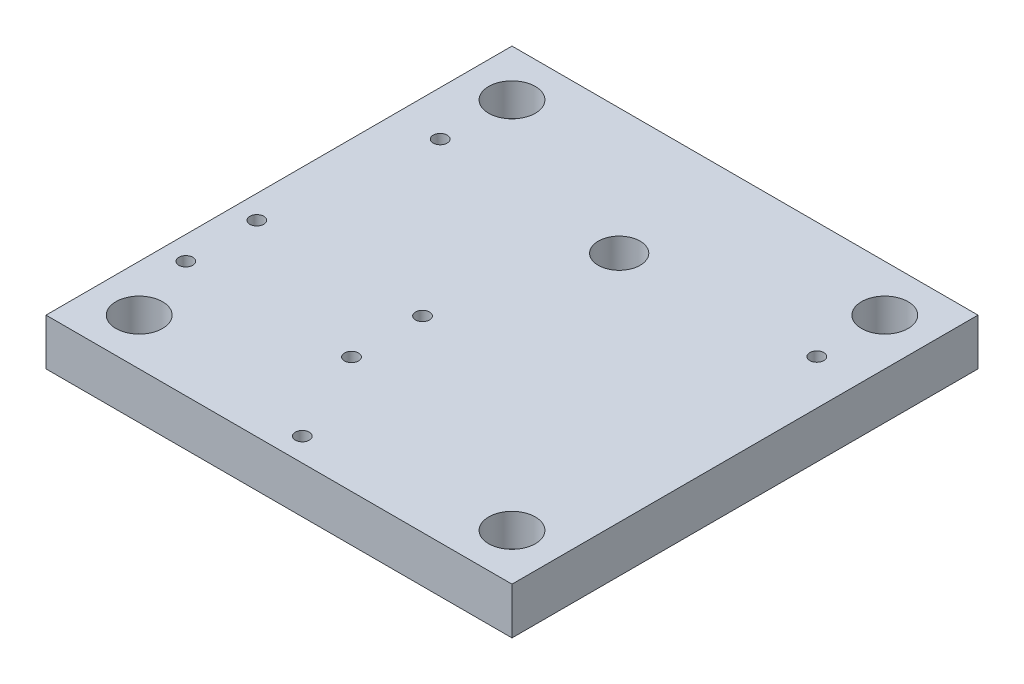
ISO-10303-21;
HEADER;
FILE_DESCRIPTION(('STEP AP214'),'2;1');
FILE_NAME('part.step','',(''),(''),'','','');
FILE_SCHEMA(('AUTOMOTIVE_DESIGN { 1 0 10303 214 1 1 1 1 }'));
ENDSEC;
DATA;
#1=APPLICATION_CONTEXT('core data for automotive mechanical design processes');
#2=APPLICATION_PROTOCOL_DEFINITION('international standard','automotive_design',2000,#1);
#3=PRODUCT_CONTEXT('',#1,'mechanical');
#4=PRODUCT('Part','Part','',(#3));
#5=PRODUCT_RELATED_PRODUCT_CATEGORY('part','',(#4));
#6=PRODUCT_DEFINITION_FORMATION('','',#4);
#7=PRODUCT_DEFINITION_CONTEXT('part definition',#1,'design');
#8=PRODUCT_DEFINITION('design','',#6,#7);
#9=PRODUCT_DEFINITION_SHAPE('','',#8);
#10=(LENGTH_UNIT() NAMED_UNIT(*) SI_UNIT(.MILLI.,.METRE.));
#11=(NAMED_UNIT(*) PLANE_ANGLE_UNIT() SI_UNIT($,.RADIAN.));
#12=(NAMED_UNIT(*) SI_UNIT($,.STERADIAN.) SOLID_ANGLE_UNIT());
#13=UNCERTAINTY_MEASURE_WITH_UNIT(LENGTH_MEASURE(1.E-05),#10,'distance_accuracy_value','');
#14=(GEOMETRIC_REPRESENTATION_CONTEXT(3) GLOBAL_UNCERTAINTY_ASSIGNED_CONTEXT((#13)) GLOBAL_UNIT_ASSIGNED_CONTEXT((#10,
#11,#12)) REPRESENTATION_CONTEXT('',''));
#15=CARTESIAN_POINT('',(0.,0.,0.));
#16=DIRECTION('',(0.,0.,1.));
#17=DIRECTION('',(1.,0.,0.));
#18=AXIS2_PLACEMENT_3D('',#15,#16,#17);
#19=CARTESIAN_POINT('',(50.,0.,27.));
#20=DIRECTION('',(0.,1.,0.));
#21=DIRECTION('',(0.,0.,1.));
#22=AXIS2_PLACEMENT_3D('',#19,#20,#21);
#23=CYLINDRICAL_SURFACE('',#22,4.5);
#24=CARTESIAN_POINT('',(50.,10.,27.));
#25=DIRECTION('',(0.,1.,0.));
#26=DIRECTION('',(0.,0.,1.));
#27=AXIS2_PLACEMENT_3D('',#24,#25,#26);
#28=CIRCLE('',#27,4.5);
#29=CARTESIAN_POINT('',(50.,10.,31.5));
#30=VERTEX_POINT('',#29);
#31=EDGE_CURVE('E142',#30,#30,#28,.T.);
#32=ORIENTED_EDGE('',*,*,#31,.T.);
#33=EDGE_LOOP('',(#32));
#34=FACE_BOUND('',#33,.T.);
#35=CARTESIAN_POINT('',(50.,3.,27.));
#36=DIRECTION('',(0.,-1.,0.));
#37=DIRECTION('',(0.,0.,-1.));
#38=AXIS2_PLACEMENT_3D('',#35,#36,#37);
#39=CIRCLE('',#38,4.5);
#40=CARTESIAN_POINT('',(50.,3.,22.5));
#41=VERTEX_POINT('',#40);
#42=EDGE_CURVE('E38',#41,#41,#39,.F.);
#43=ORIENTED_EDGE('',*,*,#42,.F.);
#44=EDGE_LOOP('',(#43));
#45=FACE_BOUND('',#44,.T.);
#46=ADVANCED_FACE('F34',(#34,#45),#23,.F.);
#47=CARTESIAN_POINT('',(0.,10.,0.));
#48=DIRECTION('',(1.,0.,0.));
#49=DIRECTION('',(0.,0.,-1.));
#50=AXIS2_PLACEMENT_3D('',#47,#48,#49);
#51=PLANE('',#50);
#52=DIRECTION('',(0.,0.,1.));
#53=VECTOR('',#52,1.);
#54=CARTESIAN_POINT('',(0.,0.,0.));
#55=LINE('',#54,#53);
#56=CARTESIAN_POINT('',(0.,0.,0.));
#57=VERTEX_POINT('',#56);
#58=CARTESIAN_POINT('',(0.,0.,100.));
#59=VERTEX_POINT('',#58);
#60=EDGE_CURVE('E100',#57,#59,#55,.T.);
#61=ORIENTED_EDGE('',*,*,#60,.T.);
#62=DIRECTION('',(0.,-1.,0.));
#63=VECTOR('',#62,1.);
#64=CARTESIAN_POINT('',(0.,10.,100.));
#65=LINE('',#64,#63);
#66=CARTESIAN_POINT('',(0.,10.,100.));
#67=VERTEX_POINT('',#66);
#68=EDGE_CURVE('E11',#67,#59,#65,.T.);
#69=ORIENTED_EDGE('',*,*,#68,.F.);
#70=DIRECTION('',(0.,0.,1.));
#71=VECTOR('',#70,1.);
#72=CARTESIAN_POINT('',(0.,10.,0.));
#73=LINE('',#72,#71);
#74=CARTESIAN_POINT('',(0.,10.,0.));
#75=VERTEX_POINT('',#74);
#76=EDGE_CURVE('E87',#75,#67,#73,.T.);
#77=ORIENTED_EDGE('',*,*,#76,.F.);
#78=DIRECTION('',(0.,-1.,0.));
#79=VECTOR('',#78,1.);
#80=CARTESIAN_POINT('',(0.,10.,0.));
#81=LINE('',#80,#79);
#82=EDGE_CURVE('E96',#75,#57,#81,.T.);
#83=ORIENTED_EDGE('',*,*,#82,.T.);
#84=EDGE_LOOP('',(#61,#69,#77,#83));
#85=FACE_BOUND('',#84,.T.);
#86=ADVANCED_FACE('F36',(#85),#51,.F.);
#87=CARTESIAN_POINT('',(0.,10.,100.));
#88=DIRECTION('',(0.,0.,-1.));
#89=DIRECTION('',(-1.,0.,0.));
#90=AXIS2_PLACEMENT_3D('',#87,#88,#89);
#91=PLANE('',#90);
#92=DIRECTION('',(1.,0.,0.));
#93=VECTOR('',#92,1.);
#94=CARTESIAN_POINT('',(0.,0.,100.));
#95=LINE('',#94,#93);
#96=CARTESIAN_POINT('',(100.,0.,100.));
#97=VERTEX_POINT('',#96);
#98=EDGE_CURVE('E91',#59,#97,#95,.T.);
#99=ORIENTED_EDGE('',*,*,#98,.T.);
#100=DIRECTION('',(0.,-1.,0.));
#101=VECTOR('',#100,1.);
#102=CARTESIAN_POINT('',(100.,10.,100.));
#103=LINE('',#102,#101);
#104=CARTESIAN_POINT('',(100.,10.,100.));
#105=VERTEX_POINT('',#104);
#106=EDGE_CURVE('E44',#105,#97,#103,.T.);
#107=ORIENTED_EDGE('',*,*,#106,.F.);
#108=DIRECTION('',(1.,0.,0.));
#109=VECTOR('',#108,1.);
#110=CARTESIAN_POINT('',(0.,10.,100.));
#111=LINE('',#110,#109);
#112=EDGE_CURVE('E82',#67,#105,#111,.T.);
#113=ORIENTED_EDGE('',*,*,#112,.F.);
#114=ORIENTED_EDGE('',*,*,#68,.T.);
#115=EDGE_LOOP('',(#99,#107,#113,#114));
#116=FACE_BOUND('',#115,.T.);
#117=ADVANCED_FACE('F90',(#116),#91,.F.);
#118=CARTESIAN_POINT('',(100.,10.,0.));
#119=DIRECTION('',(-1.,0.,0.));
#120=DIRECTION('',(0.,0.,1.));
#121=AXIS2_PLACEMENT_3D('',#118,#119,#120);
#122=PLANE('',#121);
#123=DIRECTION('',(0.,0.,-1.));
#124=VECTOR('',#123,1.);
#125=CARTESIAN_POINT('',(100.,0.,0.));
#126=LINE('',#125,#124);
#127=CARTESIAN_POINT('',(100.,0.,0.));
#128=VERTEX_POINT('',#127);
#129=EDGE_CURVE('E69',#97,#128,#126,.T.);
#130=ORIENTED_EDGE('',*,*,#129,.T.);
#131=DIRECTION('',(0.,-1.,0.));
#132=VECTOR('',#131,1.);
#133=CARTESIAN_POINT('',(100.,10.,0.));
#134=LINE('',#133,#132);
#135=CARTESIAN_POINT('',(100.,10.,0.));
#136=VERTEX_POINT('',#135);
#137=EDGE_CURVE('E92',#136,#128,#134,.T.);
#138=ORIENTED_EDGE('',*,*,#137,.F.);
#139=DIRECTION('',(0.,0.,-1.));
#140=VECTOR('',#139,1.);
#141=CARTESIAN_POINT('',(100.,10.,0.));
#142=LINE('',#141,#140);
#143=EDGE_CURVE('E85',#105,#136,#142,.T.);
#144=ORIENTED_EDGE('',*,*,#143,.F.);
#145=ORIENTED_EDGE('',*,*,#106,.T.);
#146=EDGE_LOOP('',(#130,#138,#144,#145));
#147=FACE_BOUND('',#146,.T.);
#148=ADVANCED_FACE('F94',(#147),#122,.F.);
#149=CARTESIAN_POINT('',(0.,10.,0.));
#150=DIRECTION('',(0.,0.,1.));
#151=DIRECTION('',(1.,0.,0.));
#152=AXIS2_PLACEMENT_3D('',#149,#150,#151);
#153=PLANE('',#152);
#154=DIRECTION('',(-1.,0.,0.));
#155=VECTOR('',#154,1.);
#156=CARTESIAN_POINT('',(0.,0.,0.));
#157=LINE('',#156,#155);
#158=EDGE_CURVE('E75',#128,#57,#157,.T.);
#159=ORIENTED_EDGE('',*,*,#158,.T.);
#160=ORIENTED_EDGE('',*,*,#82,.F.);
#161=DIRECTION('',(-1.,0.,0.));
#162=VECTOR('',#161,1.);
#163=CARTESIAN_POINT('',(0.,10.,0.));
#164=LINE('',#163,#162);
#165=EDGE_CURVE('E52',#136,#75,#164,.T.);
#166=ORIENTED_EDGE('',*,*,#165,.F.);
#167=ORIENTED_EDGE('',*,*,#137,.T.);
#168=EDGE_LOOP('',(#159,#160,#166,#167));
#169=FACE_BOUND('',#168,.T.);
#170=ADVANCED_FACE('F108',(#169),#153,.F.);
#171=CARTESIAN_POINT('',(0.,10.,0.));
#172=DIRECTION('',(0.,1.,0.));
#173=DIRECTION('',(0.,0.,1.));
#174=AXIS2_PLACEMENT_3D('',#171,#172,#173);
#175=PLANE('',#174);
#176=CARTESIAN_POINT('',(40.56,10.,75.));
#177=DIRECTION('',(0.,1.,0.));
#178=DIRECTION('',(0.,0.,1.));
#179=AXIS2_PLACEMENT_3D('',#176,#177,#178);
#180=CIRCLE('',#179,1.5);
#181=CARTESIAN_POINT('',(40.56,10.,76.5));
#182=VERTEX_POINT('',#181);
#183=EDGE_CURVE('E178',#182,#182,#180,.T.);
#184=ORIENTED_EDGE('',*,*,#183,.F.);
#185=EDGE_LOOP('',(#184));
#186=FACE_BOUND('',#185,.T.);
#187=CARTESIAN_POINT('',(5.,10.,59.76));
#188=DIRECTION('',(0.,1.,0.));
#189=DIRECTION('',(0.,0.,1.));
#190=AXIS2_PLACEMENT_3D('',#187,#188,#189);
#191=CIRCLE('',#190,1.5);
#192=CARTESIAN_POINT('',(5.,10.,61.26));
#193=VERTEX_POINT('',#192);
#194=EDGE_CURVE('E171',#193,#193,#191,.T.);
#195=ORIENTED_EDGE('',*,*,#194,.F.);
#196=EDGE_LOOP('',(#195));
#197=FACE_BOUND('',#196,.T.);
#198=CARTESIAN_POINT('',(5.,10.,75.));
#199=DIRECTION('',(0.,1.,0.));
#200=DIRECTION('',(0.,0.,1.));
#201=AXIS2_PLACEMENT_3D('',#198,#199,#200);
#202=CIRCLE('',#201,1.5);
#203=CARTESIAN_POINT('',(5.,10.,76.5));
#204=VERTEX_POINT('',#203);
#205=EDGE_CURVE('E183',#204,#204,#202,.T.);
#206=ORIENTED_EDGE('',*,*,#205,.F.);
#207=EDGE_LOOP('',(#206));
#208=FACE_BOUND('',#207,.T.);
#209=CARTESIAN_POINT('',(40.56,10.,59.76));
#210=DIRECTION('',(0.,1.,0.));
#211=DIRECTION('',(0.,0.,1.));
#212=AXIS2_PLACEMENT_3D('',#209,#210,#211);
#213=CIRCLE('',#212,1.5);
#214=CARTESIAN_POINT('',(40.56,10.,61.26));
#215=VERTEX_POINT('',#214);
#216=EDGE_CURVE('E165',#215,#215,#213,.T.);
#217=ORIENTED_EDGE('',*,*,#216,.F.);
#218=EDGE_LOOP('',(#217));
#219=FACE_BOUND('',#218,.T.);
#220=ORIENTED_EDGE('',*,*,#31,.F.);
#221=EDGE_LOOP('',(#220));
#222=FACE_BOUND('',#221,.T.);
#223=CARTESIAN_POINT('',(50.,10.,95.));
#224=DIRECTION('',(0.,1.,0.));
#225=DIRECTION('',(0.,0.,1.));
#226=AXIS2_PLACEMENT_3D('',#223,#224,#225);
#227=CIRCLE('',#226,1.5);
#228=CARTESIAN_POINT('',(50.,10.,96.5));
#229=VERTEX_POINT('',#228);
#230=EDGE_CURVE('E151',#229,#229,#227,.T.);
#231=ORIENTED_EDGE('',*,*,#230,.F.);
#232=EDGE_LOOP('',(#231));
#233=FACE_BOUND('',#232,.T.);
#234=CARTESIAN_POINT('',(90.4145188432738,10.,25.));
#235=DIRECTION('',(0.,1.,0.));
#236=DIRECTION('',(0.,0.,1.));
#237=AXIS2_PLACEMENT_3D('',#234,#235,#236);
#238=CIRCLE('',#237,1.5);
#239=CARTESIAN_POINT('',(90.4145188432738,10.,26.5));
#240=VERTEX_POINT('',#239);
#241=EDGE_CURVE('E145',#240,#240,#238,.T.);
#242=ORIENTED_EDGE('',*,*,#241,.F.);
#243=EDGE_LOOP('',(#242));
#244=FACE_BOUND('',#243,.T.);
#245=CARTESIAN_POINT('',(9.58548115672619,10.,25.));
#246=DIRECTION('',(0.,1.,0.));
#247=DIRECTION('',(0.,0.,1.));
#248=AXIS2_PLACEMENT_3D('',#245,#246,#247);
#249=CIRCLE('',#248,1.5);
#250=CARTESIAN_POINT('',(9.58548115672619,10.,26.5));
#251=VERTEX_POINT('',#250);
#252=EDGE_CURVE('E138',#251,#251,#249,.T.);
#253=ORIENTED_EDGE('',*,*,#252,.F.);
#254=EDGE_LOOP('',(#253));
#255=FACE_BOUND('',#254,.T.);
#256=CARTESIAN_POINT('',(90.,10.,9.99999999999998));
#257=DIRECTION('',(0.,1.,0.));
#258=DIRECTION('',(0.,0.,1.));
#259=AXIS2_PLACEMENT_3D('',#256,#257,#258);
#260=CIRCLE('',#259,5.);
#261=CARTESIAN_POINT('',(90.,10.,15.));
#262=VERTEX_POINT('',#261);
#263=EDGE_CURVE('E127',#262,#262,#260,.T.);
#264=ORIENTED_EDGE('',*,*,#263,.F.);
#265=EDGE_LOOP('',(#264));
#266=FACE_BOUND('',#265,.T.);
#267=CARTESIAN_POINT('',(10.,10.,90.));
#268=DIRECTION('',(0.,1.,0.));
#269=DIRECTION('',(0.,0.,1.));
#270=AXIS2_PLACEMENT_3D('',#267,#268,#269);
#271=CIRCLE('',#270,5.);
#272=CARTESIAN_POINT('',(10.,10.,95.));
#273=VERTEX_POINT('',#272);
#274=EDGE_CURVE('E120',#273,#273,#271,.T.);
#275=ORIENTED_EDGE('',*,*,#274,.F.);
#276=EDGE_LOOP('',(#275));
#277=FACE_BOUND('',#276,.T.);
#278=CARTESIAN_POINT('',(90.,10.,90.));
#279=DIRECTION('',(0.,1.,0.));
#280=DIRECTION('',(0.,0.,1.));
#281=AXIS2_PLACEMENT_3D('',#278,#279,#280);
#282=CIRCLE('',#281,5.00000000000001);
#283=CARTESIAN_POINT('',(90.,10.,95.));
#284=VERTEX_POINT('',#283);
#285=EDGE_CURVE('E132',#284,#284,#282,.T.);
#286=ORIENTED_EDGE('',*,*,#285,.F.);
#287=EDGE_LOOP('',(#286));
#288=FACE_BOUND('',#287,.T.);
#289=CARTESIAN_POINT('',(9.99999999999999,10.,10.));
#290=DIRECTION('',(0.,1.,0.));
#291=DIRECTION('',(0.,0.,1.));
#292=AXIS2_PLACEMENT_3D('',#289,#290,#291);
#293=CIRCLE('',#292,5.);
#294=CARTESIAN_POINT('',(9.99999999999999,10.,15.));
#295=VERTEX_POINT('',#294);
#296=EDGE_CURVE('E114',#295,#295,#293,.T.);
#297=ORIENTED_EDGE('',*,*,#296,.F.);
#298=EDGE_LOOP('',(#297));
#299=FACE_BOUND('',#298,.T.);
#300=ORIENTED_EDGE('',*,*,#76,.T.);
#301=ORIENTED_EDGE('',*,*,#112,.T.);
#302=ORIENTED_EDGE('',*,*,#143,.T.);
#303=ORIENTED_EDGE('',*,*,#165,.T.);
#304=EDGE_LOOP('',(#300,#301,#302,#303));
#305=FACE_BOUND('',#304,.T.);
#306=ADVANCED_FACE('F83',(#186,#197,#208,#219,#222,#233,#244,#255,#266,#277,#288,#299,#305),
#175,.T.);
#307=CARTESIAN_POINT('',(0.,0.,0.));
#308=DIRECTION('',(0.,1.,0.));
#309=DIRECTION('',(0.,0.,1.));
#310=AXIS2_PLACEMENT_3D('',#307,#308,#309);
#311=PLANE('',#310);
#312=CARTESIAN_POINT('',(65.,0.,27.));
#313=DIRECTION('',(0.,-1.,0.));
#314=DIRECTION('',(0.,0.,-1.));
#315=AXIS2_PLACEMENT_3D('',#312,#313,#314);
#316=CIRCLE('',#315,1.4);
#317=CARTESIAN_POINT('',(65.,0.,25.6));
#318=VERTEX_POINT('',#317);
#319=EDGE_CURVE('E195',#318,#318,#316,.T.);
#320=ORIENTED_EDGE('',*,*,#319,.F.);
#321=EDGE_LOOP('',(#320));
#322=FACE_BOUND('',#321,.T.);
#323=CARTESIAN_POINT('',(35.,0.,27.));
#324=DIRECTION('',(0.,-1.,0.));
#325=DIRECTION('',(0.,0.,-1.));
#326=AXIS2_PLACEMENT_3D('',#323,#324,#325);
#327=CIRCLE('',#326,1.4);
#328=CARTESIAN_POINT('',(35.,0.,25.6));
#329=VERTEX_POINT('',#328);
#330=EDGE_CURVE('E189',#329,#329,#327,.T.);
#331=ORIENTED_EDGE('',*,*,#330,.F.);
#332=EDGE_LOOP('',(#331));
#333=FACE_BOUND('',#332,.T.);
#334=CARTESIAN_POINT('',(40.56,0.,75.));
#335=DIRECTION('',(0.,1.,0.));
#336=DIRECTION('',(0.,0.,1.));
#337=AXIS2_PLACEMENT_3D('',#334,#335,#336);
#338=CIRCLE('',#337,1.5);
#339=CARTESIAN_POINT('',(40.56,0.,76.5));
#340=VERTEX_POINT('',#339);
#341=EDGE_CURVE('E168',#340,#340,#338,.T.);
#342=ORIENTED_EDGE('',*,*,#341,.T.);
#343=EDGE_LOOP('',(#342));
#344=FACE_BOUND('',#343,.T.);
#345=CARTESIAN_POINT('',(5.,0.,59.76));
#346=DIRECTION('',(0.,1.,0.));
#347=DIRECTION('',(0.,0.,1.));
#348=AXIS2_PLACEMENT_3D('',#345,#346,#347);
#349=CIRCLE('',#348,1.5);
#350=CARTESIAN_POINT('',(5.,0.,61.26));
#351=VERTEX_POINT('',#350);
#352=EDGE_CURVE('E174',#351,#351,#349,.T.);
#353=ORIENTED_EDGE('',*,*,#352,.T.);
#354=EDGE_LOOP('',(#353));
#355=FACE_BOUND('',#354,.T.);
#356=CARTESIAN_POINT('',(5.,0.,75.));
#357=DIRECTION('',(0.,1.,0.));
#358=DIRECTION('',(0.,0.,1.));
#359=AXIS2_PLACEMENT_3D('',#356,#357,#358);
#360=CIRCLE('',#359,1.5);
#361=CARTESIAN_POINT('',(5.,0.,76.5));
#362=VERTEX_POINT('',#361);
#363=EDGE_CURVE('E175',#362,#362,#360,.T.);
#364=ORIENTED_EDGE('',*,*,#363,.T.);
#365=EDGE_LOOP('',(#364));
#366=FACE_BOUND('',#365,.T.);
#367=CARTESIAN_POINT('',(40.56,0.,59.76));
#368=DIRECTION('',(0.,1.,0.));
#369=DIRECTION('',(0.,0.,1.));
#370=AXIS2_PLACEMENT_3D('',#367,#368,#369);
#371=CIRCLE('',#370,1.5);
#372=CARTESIAN_POINT('',(40.56,0.,61.26));
#373=VERTEX_POINT('',#372);
#374=EDGE_CURVE('E162',#373,#373,#371,.T.);
#375=ORIENTED_EDGE('',*,*,#374,.T.);
#376=EDGE_LOOP('',(#375));
#377=FACE_BOUND('',#376,.T.);
#378=CARTESIAN_POINT('',(50.,0.,27.));
#379=DIRECTION('',(0.,-1.,0.));
#380=DIRECTION('',(0.,0.,-1.));
#381=AXIS2_PLACEMENT_3D('',#378,#379,#380);
#382=CIRCLE('',#381,6.5);
#383=CARTESIAN_POINT('',(50.,0.,20.5));
#384=VERTEX_POINT('',#383);
#385=EDGE_CURVE('E158',#384,#384,#382,.T.);
#386=ORIENTED_EDGE('',*,*,#385,.F.);
#387=EDGE_LOOP('',(#386));
#388=FACE_BOUND('',#387,.T.);
#389=CARTESIAN_POINT('',(50.,0.,95.));
#390=DIRECTION('',(0.,1.,0.));
#391=DIRECTION('',(0.,0.,1.));
#392=AXIS2_PLACEMENT_3D('',#389,#390,#391);
#393=CIRCLE('',#392,1.5);
#394=CARTESIAN_POINT('',(50.,0.,96.5));
#395=VERTEX_POINT('',#394);
#396=EDGE_CURVE('E135',#395,#395,#393,.T.);
#397=ORIENTED_EDGE('',*,*,#396,.T.);
#398=EDGE_LOOP('',(#397));
#399=FACE_BOUND('',#398,.T.);
#400=CARTESIAN_POINT('',(90.4145188432738,0.,25.));
#401=DIRECTION('',(0.,1.,0.));
#402=DIRECTION('',(0.,0.,1.));
#403=AXIS2_PLACEMENT_3D('',#400,#401,#402);
#404=CIRCLE('',#403,1.5);
#405=CARTESIAN_POINT('',(90.4145188432738,0.,26.5));
#406=VERTEX_POINT('',#405);
#407=EDGE_CURVE('E148',#406,#406,#404,.T.);
#408=ORIENTED_EDGE('',*,*,#407,.T.);
#409=EDGE_LOOP('',(#408));
#410=FACE_BOUND('',#409,.T.);
#411=CARTESIAN_POINT('',(9.58548115672619,0.,25.));
#412=DIRECTION('',(0.,1.,0.));
#413=DIRECTION('',(0.,0.,1.));
#414=AXIS2_PLACEMENT_3D('',#411,#412,#413);
#415=CIRCLE('',#414,1.5);
#416=CARTESIAN_POINT('',(9.58548115672619,0.,26.5));
#417=VERTEX_POINT('',#416);
#418=EDGE_CURVE('E141',#417,#417,#415,.T.);
#419=ORIENTED_EDGE('',*,*,#418,.T.);
#420=EDGE_LOOP('',(#419));
#421=FACE_BOUND('',#420,.T.);
#422=ORIENTED_EDGE('',*,*,#60,.F.);
#423=ORIENTED_EDGE('',*,*,#158,.F.);
#424=ORIENTED_EDGE('',*,*,#129,.F.);
#425=ORIENTED_EDGE('',*,*,#98,.F.);
#426=EDGE_LOOP('',(#422,#423,#424,#425));
#427=FACE_BOUND('',#426,.T.);
#428=ADVANCED_FACE('F111',(#322,#333,#344,#355,#366,#377,#388,#399,#410,#421,#427),#311,.F.);
#429=CARTESIAN_POINT('',(9.99999999999999,3.,10.));
#430=DIRECTION('',(0.,1.,0.));
#431=DIRECTION('',(0.,0.,1.));
#432=AXIS2_PLACEMENT_3D('',#429,#430,#431);
#433=CYLINDRICAL_SURFACE('',#432,5.);
#434=CARTESIAN_POINT('',(9.99999999999999,3.,10.));
#435=DIRECTION('',(0.,1.,0.));
#436=DIRECTION('',(0.,0.,1.));
#437=AXIS2_PLACEMENT_3D('',#434,#435,#436);
#438=CIRCLE('',#437,5.);
#439=CARTESIAN_POINT('',(9.99999999999999,3.,15.));
#440=VERTEX_POINT('',#439);
#441=EDGE_CURVE('E103',#440,#440,#438,.T.);
#442=ORIENTED_EDGE('',*,*,#441,.F.);
#443=EDGE_LOOP('',(#442));
#444=FACE_BOUND('',#443,.T.);
#445=ORIENTED_EDGE('',*,*,#296,.T.);
#446=EDGE_LOOP('',(#445));
#447=FACE_BOUND('',#446,.T.);
#448=ADVANCED_FACE('F212',(#444,#447),#433,.F.);
#449=CARTESIAN_POINT('',(9.99999999999999,3.,10.));
#450=DIRECTION('',(0.,1.,0.));
#451=DIRECTION('',(0.,0.,1.));
#452=AXIS2_PLACEMENT_3D('',#449,#450,#451);
#453=PLANE('',#452);
#454=ORIENTED_EDGE('',*,*,#441,.T.);
#455=EDGE_LOOP('',(#454));
#456=FACE_BOUND('',#455,.T.);
#457=ADVANCED_FACE('F253',(#456),#453,.T.);
#458=CARTESIAN_POINT('',(90.,3.,90.));
#459=DIRECTION('',(0.,1.,0.));
#460=DIRECTION('',(0.,0.,1.));
#461=AXIS2_PLACEMENT_3D('',#458,#459,#460);
#462=CYLINDRICAL_SURFACE('',#461,5.00000000000001);
#463=CARTESIAN_POINT('',(90.,3.,90.));
#464=DIRECTION('',(0.,1.,0.));
#465=DIRECTION('',(0.,0.,1.));
#466=AXIS2_PLACEMENT_3D('',#463,#464,#465);
#467=CIRCLE('',#466,5.00000000000001);
#468=CARTESIAN_POINT('',(90.,3.,95.));
#469=VERTEX_POINT('',#468);
#470=EDGE_CURVE('E124',#469,#469,#467,.T.);
#471=ORIENTED_EDGE('',*,*,#470,.F.);
#472=EDGE_LOOP('',(#471));
#473=FACE_BOUND('',#472,.T.);
#474=ORIENTED_EDGE('',*,*,#285,.T.);
#475=EDGE_LOOP('',(#474));
#476=FACE_BOUND('',#475,.T.);
#477=ADVANCED_FACE('F259',(#473,#476),#462,.F.);
#478=CARTESIAN_POINT('',(90.,3.,90.));
#479=DIRECTION('',(0.,1.,0.));
#480=DIRECTION('',(0.,0.,1.));
#481=AXIS2_PLACEMENT_3D('',#478,#479,#480);
#482=PLANE('',#481);
#483=ORIENTED_EDGE('',*,*,#470,.T.);
#484=EDGE_LOOP('',(#483));
#485=FACE_BOUND('',#484,.T.);
#486=ADVANCED_FACE('F282',(#485),#482,.T.);
#487=CARTESIAN_POINT('',(10.,3.,90.));
#488=DIRECTION('',(0.,1.,0.));
#489=DIRECTION('',(0.,0.,1.));
#490=AXIS2_PLACEMENT_3D('',#487,#488,#489);
#491=CYLINDRICAL_SURFACE('',#490,5.);
#492=CARTESIAN_POINT('',(10.,3.,90.));
#493=DIRECTION('',(0.,1.,0.));
#494=DIRECTION('',(0.,0.,1.));
#495=AXIS2_PLACEMENT_3D('',#492,#493,#494);
#496=CIRCLE('',#495,5.);
#497=CARTESIAN_POINT('',(10.,3.,95.));
#498=VERTEX_POINT('',#497);
#499=EDGE_CURVE('E123',#498,#498,#496,.T.);
#500=ORIENTED_EDGE('',*,*,#499,.F.);
#501=EDGE_LOOP('',(#500));
#502=FACE_BOUND('',#501,.T.);
#503=ORIENTED_EDGE('',*,*,#274,.T.);
#504=EDGE_LOOP('',(#503));
#505=FACE_BOUND('',#504,.T.);
#506=ADVANCED_FACE('F285',(#502,#505),#491,.F.);
#507=CARTESIAN_POINT('',(10.,3.,90.));
#508=DIRECTION('',(0.,1.,0.));
#509=DIRECTION('',(0.,0.,1.));
#510=AXIS2_PLACEMENT_3D('',#507,#508,#509);
#511=PLANE('',#510);
#512=ORIENTED_EDGE('',*,*,#499,.T.);
#513=EDGE_LOOP('',(#512));
#514=FACE_BOUND('',#513,.T.);
#515=ADVANCED_FACE('F296',(#514),#511,.T.);
#516=CARTESIAN_POINT('',(90.,3.,9.99999999999998));
#517=DIRECTION('',(0.,1.,0.));
#518=DIRECTION('',(0.,0.,1.));
#519=AXIS2_PLACEMENT_3D('',#516,#517,#518);
#520=CYLINDRICAL_SURFACE('',#519,5.);
#521=CARTESIAN_POINT('',(90.,3.,9.99999999999998));
#522=DIRECTION('',(0.,1.,0.));
#523=DIRECTION('',(0.,0.,1.));
#524=AXIS2_PLACEMENT_3D('',#521,#522,#523);
#525=CIRCLE('',#524,5.);
#526=CARTESIAN_POINT('',(90.,3.,15.));
#527=VERTEX_POINT('',#526);
#528=EDGE_CURVE('E117',#527,#527,#525,.T.);
#529=ORIENTED_EDGE('',*,*,#528,.F.);
#530=EDGE_LOOP('',(#529));
#531=FACE_BOUND('',#530,.T.);
#532=ORIENTED_EDGE('',*,*,#263,.T.);
#533=EDGE_LOOP('',(#532));
#534=FACE_BOUND('',#533,.T.);
#535=ADVANCED_FACE('F292',(#531,#534),#520,.F.);
#536=CARTESIAN_POINT('',(90.,3.,9.99999999999998));
#537=DIRECTION('',(0.,1.,0.));
#538=DIRECTION('',(0.,0.,1.));
#539=AXIS2_PLACEMENT_3D('',#536,#537,#538);
#540=PLANE('',#539);
#541=ORIENTED_EDGE('',*,*,#528,.T.);
#542=EDGE_LOOP('',(#541));
#543=FACE_BOUND('',#542,.T.);
#544=ADVANCED_FACE('F236',(#543),#540,.T.);
#545=CARTESIAN_POINT('',(9.58548115672619,0.,25.));
#546=DIRECTION('',(0.,1.,0.));
#547=DIRECTION('',(0.,0.,1.));
#548=AXIS2_PLACEMENT_3D('',#545,#546,#547);
#549=CYLINDRICAL_SURFACE('',#548,1.5);
#550=ORIENTED_EDGE('',*,*,#418,.F.);
#551=EDGE_LOOP('',(#550));
#552=FACE_BOUND('',#551,.T.);
#553=ORIENTED_EDGE('',*,*,#252,.T.);
#554=EDGE_LOOP('',(#553));
#555=FACE_BOUND('',#554,.T.);
#556=ADVANCED_FACE('F232',(#552,#555),#549,.F.);
#557=CARTESIAN_POINT('',(90.4145188432738,0.,25.));
#558=DIRECTION('',(0.,1.,0.));
#559=DIRECTION('',(0.,0.,1.));
#560=AXIS2_PLACEMENT_3D('',#557,#558,#559);
#561=CYLINDRICAL_SURFACE('',#560,1.5);
#562=ORIENTED_EDGE('',*,*,#407,.F.);
#563=EDGE_LOOP('',(#562));
#564=FACE_BOUND('',#563,.T.);
#565=ORIENTED_EDGE('',*,*,#241,.T.);
#566=EDGE_LOOP('',(#565));
#567=FACE_BOUND('',#566,.T.);
#568=ADVANCED_FACE('F235',(#564,#567),#561,.F.);
#569=CARTESIAN_POINT('',(50.,0.,95.));
#570=DIRECTION('',(0.,1.,0.));
#571=DIRECTION('',(0.,0.,1.));
#572=AXIS2_PLACEMENT_3D('',#569,#570,#571);
#573=CYLINDRICAL_SURFACE('',#572,1.5);
#574=ORIENTED_EDGE('',*,*,#396,.F.);
#575=EDGE_LOOP('',(#574));
#576=FACE_BOUND('',#575,.T.);
#577=ORIENTED_EDGE('',*,*,#230,.T.);
#578=EDGE_LOOP('',(#577));
#579=FACE_BOUND('',#578,.T.);
#580=ADVANCED_FACE('F274',(#576,#579),#573,.F.);
#581=CARTESIAN_POINT('',(50.,3.,27.));
#582=DIRECTION('',(0.,-1.,0.));
#583=DIRECTION('',(0.,0.,-1.));
#584=AXIS2_PLACEMENT_3D('',#581,#582,#583);
#585=PLANE('',#584);
#586=CARTESIAN_POINT('',(50.,3.,27.));
#587=DIRECTION('',(0.,-1.,0.));
#588=DIRECTION('',(0.,0.,-1.));
#589=AXIS2_PLACEMENT_3D('',#586,#587,#588);
#590=CIRCLE('',#589,6.5);
#591=CARTESIAN_POINT('',(50.,3.,20.5));
#592=VERTEX_POINT('',#591);
#593=EDGE_CURVE('E161',#592,#592,#590,.T.);
#594=ORIENTED_EDGE('',*,*,#593,.T.);
#595=EDGE_LOOP('',(#594));
#596=FACE_BOUND('',#595,.T.);
#597=ORIENTED_EDGE('',*,*,#42,.T.);
#598=EDGE_LOOP('',(#597));
#599=FACE_BOUND('',#598,.T.);
#600=ADVANCED_FACE('F277',(#596,#599),#585,.T.);
#601=CARTESIAN_POINT('',(50.,3.,27.));
#602=DIRECTION('',(0.,-1.,0.));
#603=DIRECTION('',(0.,0.,-1.));
#604=AXIS2_PLACEMENT_3D('',#601,#602,#603);
#605=CYLINDRICAL_SURFACE('',#604,6.5);
#606=ORIENTED_EDGE('',*,*,#593,.F.);
#607=EDGE_LOOP('',(#606));
#608=FACE_BOUND('',#607,.T.);
#609=ORIENTED_EDGE('',*,*,#385,.T.);
#610=EDGE_LOOP('',(#609));
#611=FACE_BOUND('',#610,.T.);
#612=ADVANCED_FACE('F272',(#608,#611),#605,.F.);
#613=CARTESIAN_POINT('',(40.56,0.,59.76));
#614=DIRECTION('',(0.,1.,0.));
#615=DIRECTION('',(0.,0.,1.));
#616=AXIS2_PLACEMENT_3D('',#613,#614,#615);
#617=CYLINDRICAL_SURFACE('',#616,1.5);
#618=ORIENTED_EDGE('',*,*,#374,.F.);
#619=EDGE_LOOP('',(#618));
#620=FACE_BOUND('',#619,.T.);
#621=ORIENTED_EDGE('',*,*,#216,.T.);
#622=EDGE_LOOP('',(#621));
#623=FACE_BOUND('',#622,.T.);
#624=ADVANCED_FACE('F345',(#620,#623),#617,.F.);
#625=CARTESIAN_POINT('',(5.,0.,75.));
#626=DIRECTION('',(0.,1.,0.));
#627=DIRECTION('',(0.,0.,1.));
#628=AXIS2_PLACEMENT_3D('',#625,#626,#627);
#629=CYLINDRICAL_SURFACE('',#628,1.5);
#630=ORIENTED_EDGE('',*,*,#363,.F.);
#631=EDGE_LOOP('',(#630));
#632=FACE_BOUND('',#631,.T.);
#633=ORIENTED_EDGE('',*,*,#205,.T.);
#634=EDGE_LOOP('',(#633));
#635=FACE_BOUND('',#634,.T.);
#636=ADVANCED_FACE('F353',(#632,#635),#629,.F.);
#637=CARTESIAN_POINT('',(5.,0.,59.76));
#638=DIRECTION('',(0.,1.,0.));
#639=DIRECTION('',(0.,0.,1.));
#640=AXIS2_PLACEMENT_3D('',#637,#638,#639);
#641=CYLINDRICAL_SURFACE('',#640,1.5);
#642=ORIENTED_EDGE('',*,*,#352,.F.);
#643=EDGE_LOOP('',(#642));
#644=FACE_BOUND('',#643,.T.);
#645=ORIENTED_EDGE('',*,*,#194,.T.);
#646=EDGE_LOOP('',(#645));
#647=FACE_BOUND('',#646,.T.);
#648=ADVANCED_FACE('F361',(#644,#647),#641,.F.);
#649=CARTESIAN_POINT('',(40.56,0.,75.));
#650=DIRECTION('',(0.,1.,0.));
#651=DIRECTION('',(0.,0.,1.));
#652=AXIS2_PLACEMENT_3D('',#649,#650,#651);
#653=CYLINDRICAL_SURFACE('',#652,1.5);
#654=ORIENTED_EDGE('',*,*,#341,.F.);
#655=EDGE_LOOP('',(#654));
#656=FACE_BOUND('',#655,.T.);
#657=ORIENTED_EDGE('',*,*,#183,.T.);
#658=EDGE_LOOP('',(#657));
#659=FACE_BOUND('',#658,.T.);
#660=ADVANCED_FACE('F369',(#656,#659),#653,.F.);
#661=CARTESIAN_POINT('',(35.,5.,27.));
#662=DIRECTION('',(0.,-1.,0.));
#663=DIRECTION('',(0.,0.,-1.));
#664=AXIS2_PLACEMENT_3D('',#661,#662,#663);
#665=CYLINDRICAL_SURFACE('',#664,1.4);
#666=CARTESIAN_POINT('',(35.,5.,27.));
#667=DIRECTION('',(0.,-1.,0.));
#668=DIRECTION('',(0.,0.,-1.));
#669=AXIS2_PLACEMENT_3D('',#666,#667,#668);
#670=CIRCLE('',#669,1.4);
#671=CARTESIAN_POINT('',(35.,5.,25.6));
#672=VERTEX_POINT('',#671);
#673=EDGE_CURVE('E192',#672,#672,#670,.T.);
#674=ORIENTED_EDGE('',*,*,#673,.F.);
#675=EDGE_LOOP('',(#674));
#676=FACE_BOUND('',#675,.T.);
#677=ORIENTED_EDGE('',*,*,#330,.T.);
#678=EDGE_LOOP('',(#677));
#679=FACE_BOUND('',#678,.T.);
#680=ADVANCED_FACE('F377',(#676,#679),#665,.F.);
#681=CARTESIAN_POINT('',(35.,5.,27.));
#682=DIRECTION('',(0.,-1.,0.));
#683=DIRECTION('',(0.,0.,-1.));
#684=AXIS2_PLACEMENT_3D('',#681,#682,#683);
#685=PLANE('',#684);
#686=ORIENTED_EDGE('',*,*,#673,.T.);
#687=EDGE_LOOP('',(#686));
#688=FACE_BOUND('',#687,.T.);
#689=ADVANCED_FACE('F206',(#688),#685,.T.);
#690=CARTESIAN_POINT('',(65.,5.,27.));
#691=DIRECTION('',(0.,-1.,0.));
#692=DIRECTION('',(0.,0.,-1.));
#693=AXIS2_PLACEMENT_3D('',#690,#691,#692);
#694=CYLINDRICAL_SURFACE('',#693,1.4);
#695=CARTESIAN_POINT('',(65.,5.,27.));
#696=DIRECTION('',(0.,-1.,0.));
#697=DIRECTION('',(0.,0.,-1.));
#698=AXIS2_PLACEMENT_3D('',#695,#696,#697);
#699=CIRCLE('',#698,1.4);
#700=CARTESIAN_POINT('',(65.,5.,25.6));
#701=VERTEX_POINT('',#700);
#702=EDGE_CURVE('E186',#701,#701,#699,.T.);
#703=ORIENTED_EDGE('',*,*,#702,.F.);
#704=EDGE_LOOP('',(#703));
#705=FACE_BOUND('',#704,.T.);
#706=ORIENTED_EDGE('',*,*,#319,.T.);
#707=EDGE_LOOP('',(#706));
#708=FACE_BOUND('',#707,.T.);
#709=ADVANCED_FACE('F203',(#705,#708),#694,.F.);
#710=CARTESIAN_POINT('',(65.,5.,27.));
#711=DIRECTION('',(0.,-1.,0.));
#712=DIRECTION('',(0.,0.,-1.));
#713=AXIS2_PLACEMENT_3D('',#710,#711,#712);
#714=PLANE('',#713);
#715=ORIENTED_EDGE('',*,*,#702,.T.);
#716=EDGE_LOOP('',(#715));
#717=FACE_BOUND('',#716,.T.);
#718=ADVANCED_FACE('F201',(#717),#714,.T.);
#719=CLOSED_SHELL('',(#46,#86,#117,#148,#170,#306,#428,#448,#457,#477,#486,#506,#515,#535,#544,
#556,#568,#580,#600,#612,#624,#636,#648,#660,#680,#689,#709,#718));
#720=MANIFOLD_SOLID_BREP('B2',#719);
#721=ADVANCED_BREP_SHAPE_REPRESENTATION('',(#18,#720),#14);
#722=SHAPE_DEFINITION_REPRESENTATION(#9,#721);
ENDSEC;
END-ISO-10303-21;
